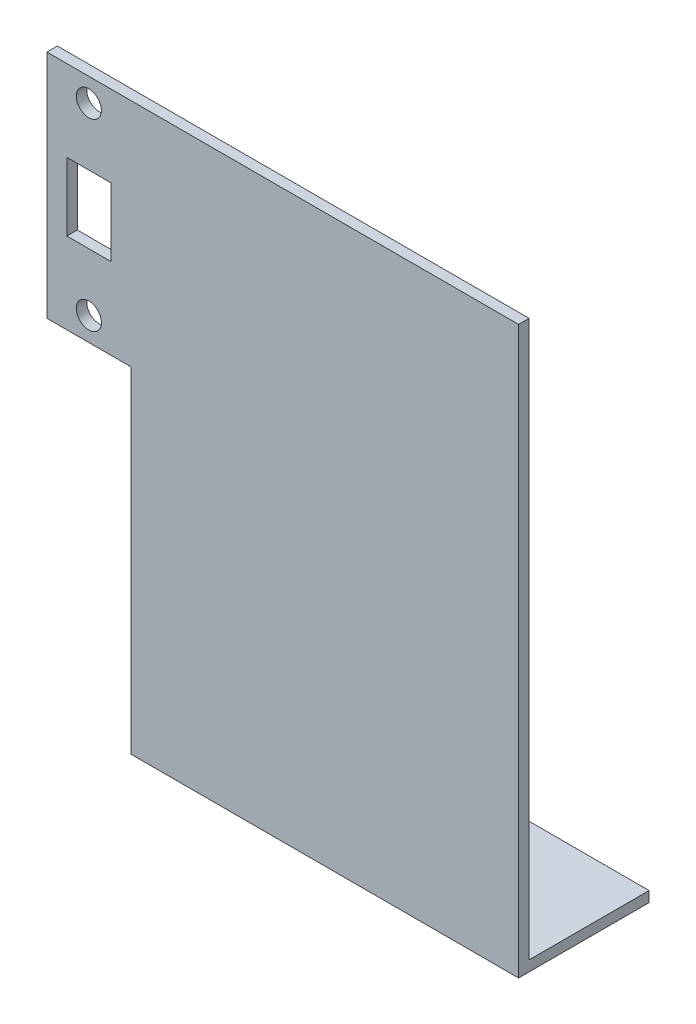
ISO-10303-21;
HEADER;
FILE_DESCRIPTION(('STEP AP214'),'2;1');
FILE_NAME('part.step','',(''),(''),'','','');
FILE_SCHEMA(('AUTOMOTIVE_DESIGN { 1 0 10303 214 1 1 1 1 }'));
ENDSEC;
DATA;
#1=APPLICATION_CONTEXT('core data for automotive mechanical design processes');
#2=APPLICATION_PROTOCOL_DEFINITION('international standard','automotive_design',2000,#1);
#3=PRODUCT_CONTEXT('',#1,'mechanical');
#4=PRODUCT('Part','Part','',(#3));
#5=PRODUCT_RELATED_PRODUCT_CATEGORY('part','',(#4));
#6=PRODUCT_DEFINITION_FORMATION('','',#4);
#7=PRODUCT_DEFINITION_CONTEXT('part definition',#1,'design');
#8=PRODUCT_DEFINITION('design','',#6,#7);
#9=PRODUCT_DEFINITION_SHAPE('','',#8);
#10=(LENGTH_UNIT() NAMED_UNIT(*) SI_UNIT(.MILLI.,.METRE.));
#11=(NAMED_UNIT(*) PLANE_ANGLE_UNIT() SI_UNIT($,.RADIAN.));
#12=(NAMED_UNIT(*) SI_UNIT($,.STERADIAN.) SOLID_ANGLE_UNIT());
#13=UNCERTAINTY_MEASURE_WITH_UNIT(LENGTH_MEASURE(1.E-05),#10,'distance_accuracy_value','');
#14=(GEOMETRIC_REPRESENTATION_CONTEXT(3) GLOBAL_UNCERTAINTY_ASSIGNED_CONTEXT((#13)) GLOBAL_UNIT_ASSIGNED_CONTEXT((#10,
#11,#12)) REPRESENTATION_CONTEXT('',''));
#15=CARTESIAN_POINT('',(0.,0.,0.));
#16=DIRECTION('',(0.,0.,1.));
#17=DIRECTION('',(1.,0.,0.));
#18=AXIS2_PLACEMENT_3D('',#15,#16,#17);
#19=CARTESIAN_POINT('',(0.,0.,0.));
#20=DIRECTION('',(0.,0.,1.));
#21=DIRECTION('',(1.,0.,0.));
#22=AXIS2_PLACEMENT_3D('',#19,#20,#21);
#23=PLANE('',#22);
#24=DIRECTION('',(1.,0.,0.));
#25=VECTOR('',#24,1.);
#26=CARTESIAN_POINT('',(0.,16.25,0.));
#27=LINE('',#26,#25);
#28=CARTESIAN_POINT('',(-24.6,16.25,0.));
#29=VERTEX_POINT('',#28);
#30=CARTESIAN_POINT('',(-20.4,16.25,0.));
#31=VERTEX_POINT('',#30);
#32=EDGE_CURVE('E44',#29,#31,#27,.T.);
#33=ORIENTED_EDGE('',*,*,#32,.T.);
#34=DIRECTION('',(0.,1.,0.));
#35=VECTOR('',#34,1.);
#36=CARTESIAN_POINT('',(-20.4,0.,0.));
#37=LINE('',#36,#35);
#38=CARTESIAN_POINT('',(-20.4,22.75,0.));
#39=VERTEX_POINT('',#38);
#40=EDGE_CURVE('E11',#31,#39,#37,.T.);
#41=ORIENTED_EDGE('',*,*,#40,.T.);
#42=DIRECTION('',(-1.,0.,0.));
#43=VECTOR('',#42,1.);
#44=CARTESIAN_POINT('',(0.,22.75,0.));
#45=LINE('',#44,#43);
#46=CARTESIAN_POINT('',(-24.6,22.75,0.));
#47=VERTEX_POINT('',#46);
#48=EDGE_CURVE('E215',#39,#47,#45,.T.);
#49=ORIENTED_EDGE('',*,*,#48,.T.);
#50=DIRECTION('',(0.,-1.,0.));
#51=VECTOR('',#50,1.);
#52=CARTESIAN_POINT('',(-24.6,0.,0.));
#53=LINE('',#52,#51);
#54=EDGE_CURVE('E218',#47,#29,#53,.T.);
#55=ORIENTED_EDGE('',*,*,#54,.T.);
#56=EDGE_LOOP('',(#33,#41,#49,#55));
#57=FACE_BOUND('',#56,.T.);
#58=CARTESIAN_POINT('',(-22.5,10.735,0.));
#59=DIRECTION('',(0.,0.,1.));
#60=DIRECTION('',(1.,0.,0.));
#61=AXIS2_PLACEMENT_3D('',#58,#59,#60);
#62=CIRCLE('',#61,1.2);
#63=CARTESIAN_POINT('',(-21.3,10.735,0.));
#64=VERTEX_POINT('',#63);
#65=EDGE_CURVE('E177',#64,#64,#62,.T.);
#66=ORIENTED_EDGE('',*,*,#65,.T.);
#67=EDGE_LOOP('',(#66));
#68=FACE_BOUND('',#67,.T.);
#69=CARTESIAN_POINT('',(-22.5,28.265,0.));
#70=DIRECTION('',(0.,0.,1.));
#71=DIRECTION('',(1.,0.,0.));
#72=AXIS2_PLACEMENT_3D('',#69,#70,#71);
#73=CIRCLE('',#72,1.2);
#74=CARTESIAN_POINT('',(-21.3,28.265,0.));
#75=VERTEX_POINT('',#74);
#76=EDGE_CURVE('E39',#75,#75,#73,.T.);
#77=ORIENTED_EDGE('',*,*,#76,.T.);
#78=EDGE_LOOP('',(#77));
#79=FACE_BOUND('',#78,.T.);
#80=DIRECTION('',(1.,0.,0.));
#81=VECTOR('',#80,1.);
#82=CARTESIAN_POINT('',(-18.5,-22.5,0.));
#83=LINE('',#82,#81);
#84=CARTESIAN_POINT('',(-18.5,-22.5,0.));
#85=VERTEX_POINT('',#84);
#86=CARTESIAN_POINT('',(18.5,-22.5,0.));
#87=VERTEX_POINT('',#86);
#88=EDGE_CURVE('E52',#85,#87,#83,.T.);
#89=ORIENTED_EDGE('',*,*,#88,.F.);
#90=DIRECTION('',(0.,-1.,0.));
#91=VECTOR('',#90,1.);
#92=CARTESIAN_POINT('',(-18.5,8.5,0.));
#93=LINE('',#92,#91);
#94=CARTESIAN_POINT('',(-18.5,8.5,0.));
#95=VERTEX_POINT('',#94);
#96=EDGE_CURVE('E134',#95,#85,#93,.T.);
#97=ORIENTED_EDGE('',*,*,#96,.F.);
#98=DIRECTION('',(1.,0.,0.));
#99=VECTOR('',#98,1.);
#100=CARTESIAN_POINT('',(-26.5,8.5,0.));
#101=LINE('',#100,#99);
#102=CARTESIAN_POINT('',(-26.5,8.5,0.));
#103=VERTEX_POINT('',#102);
#104=EDGE_CURVE('E198',#103,#95,#101,.T.);
#105=ORIENTED_EDGE('',*,*,#104,.F.);
#106=DIRECTION('',(0.,-1.,0.));
#107=VECTOR('',#106,1.);
#108=CARTESIAN_POINT('',(-26.5,30.5,0.));
#109=LINE('',#108,#107);
#110=CARTESIAN_POINT('',(-26.5,30.5,0.));
#111=VERTEX_POINT('',#110);
#112=EDGE_CURVE('E196',#111,#103,#109,.T.);
#113=ORIENTED_EDGE('',*,*,#112,.F.);
#114=DIRECTION('',(-1.,0.,0.));
#115=VECTOR('',#114,1.);
#116=CARTESIAN_POINT('',(-18.5,30.5,0.));
#117=LINE('',#116,#115);
#118=CARTESIAN_POINT('',(18.5,30.5,0.));
#119=VERTEX_POINT('',#118);
#120=EDGE_CURVE('E129',#119,#111,#117,.T.);
#121=ORIENTED_EDGE('',*,*,#120,.F.);
#122=DIRECTION('',(0.,1.,0.));
#123=VECTOR('',#122,1.);
#124=CARTESIAN_POINT('',(18.5,23.5,0.));
#125=LINE('',#124,#123);
#126=EDGE_CURVE('E126',#87,#119,#125,.T.);
#127=ORIENTED_EDGE('',*,*,#126,.F.);
#128=EDGE_LOOP('',(#89,#97,#105,#113,#121,#127));
#129=FACE_BOUND('',#128,.T.);
#130=ADVANCED_FACE('F35',(#57,#68,#79,#129),#23,.F.);
#131=CARTESIAN_POINT('',(-18.5,30.5,1.));
#132=DIRECTION('',(0.,-1.,0.));
#133=DIRECTION('',(0.,0.,-1.));
#134=AXIS2_PLACEMENT_3D('',#131,#132,#133);
#135=PLANE('',#134);
#136=ORIENTED_EDGE('',*,*,#120,.T.);
#137=DIRECTION('',(0.,0.,-1.));
#138=VECTOR('',#137,1.);
#139=CARTESIAN_POINT('',(-26.5,30.5,1.));
#140=LINE('',#139,#138);
#141=CARTESIAN_POINT('',(-26.5,30.5,1.));
#142=VERTEX_POINT('',#141);
#143=EDGE_CURVE('E212',#142,#111,#140,.T.);
#144=ORIENTED_EDGE('',*,*,#143,.F.);
#145=DIRECTION('',(-1.,0.,0.));
#146=VECTOR('',#145,1.);
#147=CARTESIAN_POINT('',(18.5,30.5,1.));
#148=LINE('',#147,#146);
#149=CARTESIAN_POINT('',(18.5,30.5,1.));
#150=VERTEX_POINT('',#149);
#151=EDGE_CURVE('E133',#150,#142,#148,.T.);
#152=ORIENTED_EDGE('',*,*,#151,.F.);
#153=DIRECTION('',(0.,0.,-1.));
#154=VECTOR('',#153,1.);
#155=CARTESIAN_POINT('',(18.5,30.5,1.));
#156=LINE('',#155,#154);
#157=EDGE_CURVE('E194',#150,#119,#156,.T.);
#158=ORIENTED_EDGE('',*,*,#157,.T.);
#159=EDGE_LOOP('',(#136,#144,#152,#158));
#160=FACE_BOUND('',#159,.T.);
#161=ADVANCED_FACE('F37',(#160),#135,.F.);
#162=CARTESIAN_POINT('',(-26.5,30.5,1.));
#163=DIRECTION('',(1.,0.,0.));
#164=DIRECTION('',(0.,1.,0.));
#165=AXIS2_PLACEMENT_3D('',#162,#163,#164);
#166=PLANE('',#165);
#167=ORIENTED_EDGE('',*,*,#112,.T.);
#168=DIRECTION('',(0.,0.,-1.));
#169=VECTOR('',#168,1.);
#170=CARTESIAN_POINT('',(-26.5,8.5,1.));
#171=LINE('',#170,#169);
#172=CARTESIAN_POINT('',(-26.5,8.5,1.));
#173=VERTEX_POINT('',#172);
#174=EDGE_CURVE('E209',#173,#103,#171,.T.);
#175=ORIENTED_EDGE('',*,*,#174,.F.);
#176=DIRECTION('',(0.,-1.,0.));
#177=VECTOR('',#176,1.);
#178=CARTESIAN_POINT('',(-26.5,30.5,1.));
#179=LINE('',#178,#177);
#180=EDGE_CURVE('E184',#142,#173,#179,.T.);
#181=ORIENTED_EDGE('',*,*,#180,.F.);
#182=ORIENTED_EDGE('',*,*,#143,.T.);
#183=EDGE_LOOP('',(#167,#175,#181,#182));
#184=FACE_BOUND('',#183,.T.);
#185=ADVANCED_FACE('F250',(#184),#166,.F.);
#186=CARTESIAN_POINT('',(-26.5,8.5,1.));
#187=DIRECTION('',(0.,1.,0.));
#188=DIRECTION('',(0.,0.,1.));
#189=AXIS2_PLACEMENT_3D('',#186,#187,#188);
#190=PLANE('',#189);
#191=ORIENTED_EDGE('',*,*,#104,.T.);
#192=DIRECTION('',(0.,0.,-1.));
#193=VECTOR('',#192,1.);
#194=CARTESIAN_POINT('',(-18.5,8.5,1.));
#195=LINE('',#194,#193);
#196=CARTESIAN_POINT('',(-18.5,8.5,1.));
#197=VERTEX_POINT('',#196);
#198=EDGE_CURVE('E206',#197,#95,#195,.T.);
#199=ORIENTED_EDGE('',*,*,#198,.F.);
#200=DIRECTION('',(1.,0.,0.));
#201=VECTOR('',#200,1.);
#202=CARTESIAN_POINT('',(-26.5,8.5,1.));
#203=LINE('',#202,#201);
#204=EDGE_CURVE('E186',#173,#197,#203,.T.);
#205=ORIENTED_EDGE('',*,*,#204,.F.);
#206=ORIENTED_EDGE('',*,*,#174,.T.);
#207=EDGE_LOOP('',(#191,#199,#205,#206));
#208=FACE_BOUND('',#207,.T.);
#209=ADVANCED_FACE('F265',(#208),#190,.F.);
#210=CARTESIAN_POINT('',(-18.5,8.5,1.));
#211=DIRECTION('',(1.,0.,0.));
#212=DIRECTION('',(0.,1.,0.));
#213=AXIS2_PLACEMENT_3D('',#210,#211,#212);
#214=PLANE('',#213);
#215=ORIENTED_EDGE('',*,*,#96,.T.);
#216=DIRECTION('',(0.,0.,1.));
#217=VECTOR('',#216,1.);
#218=CARTESIAN_POINT('',(-18.5,-22.5,-48.4635110466435));
#219=LINE('',#218,#217);
#220=CARTESIAN_POINT('',(-18.5,-22.5,-11.45));
#221=VERTEX_POINT('',#220);
#222=EDGE_CURVE('E144',#221,#85,#219,.T.);
#223=ORIENTED_EDGE('',*,*,#222,.F.);
#224=DIRECTION('',(0.,-1.,0.));
#225=VECTOR('',#224,1.);
#226=CARTESIAN_POINT('',(-18.5,-23.5,-11.45));
#227=LINE('',#226,#225);
#228=CARTESIAN_POINT('',(-18.5,-23.5,-11.45));
#229=VERTEX_POINT('',#228);
#230=EDGE_CURVE('E151',#221,#229,#227,.T.);
#231=ORIENTED_EDGE('',*,*,#230,.T.);
#232=DIRECTION('',(0.,0.,-1.));
#233=VECTOR('',#232,1.);
#234=CARTESIAN_POINT('',(-18.5,-23.5,1.));
#235=LINE('',#234,#233);
#236=CARTESIAN_POINT('',(-18.5,-23.5,1.));
#237=VERTEX_POINT('',#236);
#238=EDGE_CURVE('E204',#237,#229,#235,.T.);
#239=ORIENTED_EDGE('',*,*,#238,.F.);
#240=DIRECTION('',(0.,-1.,0.));
#241=VECTOR('',#240,1.);
#242=CARTESIAN_POINT('',(-18.5,8.5,1.));
#243=LINE('',#242,#241);
#244=EDGE_CURVE('E188',#197,#237,#243,.T.);
#245=ORIENTED_EDGE('',*,*,#244,.F.);
#246=ORIENTED_EDGE('',*,*,#198,.T.);
#247=EDGE_LOOP('',(#215,#223,#231,#239,#245,#246));
#248=FACE_BOUND('',#247,.T.);
#249=ADVANCED_FACE('F261',(#248),#214,.F.);
#250=CARTESIAN_POINT('',(-18.5,-23.5,1.));
#251=DIRECTION('',(0.,1.,0.));
#252=DIRECTION('',(0.,0.,1.));
#253=AXIS2_PLACEMENT_3D('',#250,#251,#252);
#254=PLANE('',#253);
#255=ORIENTED_EDGE('',*,*,#238,.T.);
#256=DIRECTION('',(1.,0.,0.));
#257=VECTOR('',#256,1.);
#258=CARTESIAN_POINT('',(-18.5,-23.5,-11.45));
#259=LINE('',#258,#257);
#260=CARTESIAN_POINT('',(18.5,-23.5,-11.45));
#261=VERTEX_POINT('',#260);
#262=EDGE_CURVE('E155',#229,#261,#259,.T.);
#263=ORIENTED_EDGE('',*,*,#262,.T.);
#264=DIRECTION('',(0.,0.,-1.));
#265=VECTOR('',#264,1.);
#266=CARTESIAN_POINT('',(18.5,-23.5,1.));
#267=LINE('',#266,#265);
#268=CARTESIAN_POINT('',(18.5,-23.5,1.));
#269=VERTEX_POINT('',#268);
#270=EDGE_CURVE('E202',#269,#261,#267,.T.);
#271=ORIENTED_EDGE('',*,*,#270,.F.);
#272=DIRECTION('',(1.,0.,0.));
#273=VECTOR('',#272,1.);
#274=CARTESIAN_POINT('',(-18.5,-23.5,1.));
#275=LINE('',#274,#273);
#276=EDGE_CURVE('E190',#237,#269,#275,.T.);
#277=ORIENTED_EDGE('',*,*,#276,.F.);
#278=EDGE_LOOP('',(#255,#263,#271,#277));
#279=FACE_BOUND('',#278,.T.);
#280=ADVANCED_FACE('F258',(#279),#254,.F.);
#281=CARTESIAN_POINT('',(18.5,23.5,1.));
#282=DIRECTION('',(-1.,0.,0.));
#283=DIRECTION('',(0.,0.,1.));
#284=AXIS2_PLACEMENT_3D('',#281,#282,#283);
#285=PLANE('',#284);
#286=ORIENTED_EDGE('',*,*,#270,.T.);
#287=DIRECTION('',(0.,1.,0.));
#288=VECTOR('',#287,1.);
#289=CARTESIAN_POINT('',(18.5,-23.5,-11.45));
#290=LINE('',#289,#288);
#291=CARTESIAN_POINT('',(18.5,-22.5,-11.45));
#292=VERTEX_POINT('',#291);
#293=EDGE_CURVE('E141',#261,#292,#290,.T.);
#294=ORIENTED_EDGE('',*,*,#293,.T.);
#295=DIRECTION('',(0.,0.,1.));
#296=VECTOR('',#295,1.);
#297=CARTESIAN_POINT('',(18.5,-22.5,-48.4635110466435));
#298=LINE('',#297,#296);
#299=EDGE_CURVE('E138',#292,#87,#298,.T.);
#300=ORIENTED_EDGE('',*,*,#299,.T.);
#301=ORIENTED_EDGE('',*,*,#126,.T.);
#302=ORIENTED_EDGE('',*,*,#157,.F.);
#303=DIRECTION('',(0.,1.,0.));
#304=VECTOR('',#303,1.);
#305=CARTESIAN_POINT('',(18.5,-23.5,1.));
#306=LINE('',#305,#304);
#307=EDGE_CURVE('E192',#269,#150,#306,.T.);
#308=ORIENTED_EDGE('',*,*,#307,.F.);
#309=EDGE_LOOP('',(#286,#294,#300,#301,#302,#308));
#310=FACE_BOUND('',#309,.T.);
#311=ADVANCED_FACE('F139',(#310),#285,.F.);
#312=CARTESIAN_POINT('',(0.,0.,1.));
#313=DIRECTION('',(0.,0.,1.));
#314=DIRECTION('',(1.,0.,0.));
#315=AXIS2_PLACEMENT_3D('',#312,#313,#314);
#316=PLANE('',#315);
#317=CARTESIAN_POINT('',(-22.5,28.265,1.));
#318=DIRECTION('',(0.,0.,1.));
#319=DIRECTION('',(1.,0.,0.));
#320=AXIS2_PLACEMENT_3D('',#317,#318,#319);
#321=CIRCLE('',#320,1.2);
#322=CARTESIAN_POINT('',(-21.3,28.265,1.));
#323=VERTEX_POINT('',#322);
#324=EDGE_CURVE('E161',#323,#323,#321,.T.);
#325=ORIENTED_EDGE('',*,*,#324,.F.);
#326=EDGE_LOOP('',(#325));
#327=FACE_BOUND('',#326,.T.);
#328=CARTESIAN_POINT('',(-22.5,10.735,1.));
#329=DIRECTION('',(0.,0.,1.));
#330=DIRECTION('',(1.,0.,0.));
#331=AXIS2_PLACEMENT_3D('',#328,#329,#330);
#332=CIRCLE('',#331,1.2);
#333=CARTESIAN_POINT('',(-21.3,10.735,1.));
#334=VERTEX_POINT('',#333);
#335=EDGE_CURVE('E158',#334,#334,#332,.T.);
#336=ORIENTED_EDGE('',*,*,#335,.F.);
#337=EDGE_LOOP('',(#336));
#338=FACE_BOUND('',#337,.T.);
#339=DIRECTION('',(0.,1.,0.));
#340=VECTOR('',#339,1.);
#341=CARTESIAN_POINT('',(-20.4,22.75,1.));
#342=LINE('',#341,#340);
#343=CARTESIAN_POINT('',(-20.4,16.25,1.));
#344=VERTEX_POINT('',#343);
#345=CARTESIAN_POINT('',(-20.4,22.75,1.));
#346=VERTEX_POINT('',#345);
#347=EDGE_CURVE('E60',#344,#346,#342,.T.);
#348=ORIENTED_EDGE('',*,*,#347,.F.);
#349=DIRECTION('',(1.,0.,0.));
#350=VECTOR('',#349,1.);
#351=CARTESIAN_POINT('',(-24.6,16.25,1.));
#352=LINE('',#351,#350);
#353=CARTESIAN_POINT('',(-24.6,16.25,1.));
#354=VERTEX_POINT('',#353);
#355=EDGE_CURVE('E171',#354,#344,#352,.T.);
#356=ORIENTED_EDGE('',*,*,#355,.F.);
#357=DIRECTION('',(0.,-1.,0.));
#358=VECTOR('',#357,1.);
#359=CARTESIAN_POINT('',(-24.6,22.75,1.));
#360=LINE('',#359,#358);
#361=CARTESIAN_POINT('',(-24.6,22.75,1.));
#362=VERTEX_POINT('',#361);
#363=EDGE_CURVE('E168',#362,#354,#360,.T.);
#364=ORIENTED_EDGE('',*,*,#363,.F.);
#365=DIRECTION('',(-1.,0.,0.));
#366=VECTOR('',#365,1.);
#367=CARTESIAN_POINT('',(-24.6,22.75,1.));
#368=LINE('',#367,#366);
#369=EDGE_CURVE('E165',#346,#362,#368,.T.);
#370=ORIENTED_EDGE('',*,*,#369,.F.);
#371=EDGE_LOOP('',(#348,#356,#364,#370));
#372=FACE_BOUND('',#371,.T.);
#373=ORIENTED_EDGE('',*,*,#151,.T.);
#374=ORIENTED_EDGE('',*,*,#180,.T.);
#375=ORIENTED_EDGE('',*,*,#204,.T.);
#376=ORIENTED_EDGE('',*,*,#244,.T.);
#377=ORIENTED_EDGE('',*,*,#276,.T.);
#378=ORIENTED_EDGE('',*,*,#307,.T.);
#379=EDGE_LOOP('',(#373,#374,#375,#376,#377,#378));
#380=FACE_BOUND('',#379,.T.);
#381=ADVANCED_FACE('F254',(#327,#338,#372,#380),#316,.T.);
#382=CARTESIAN_POINT('',(-20.4,22.75,-10.));
#383=DIRECTION('',(1.,0.,0.));
#384=DIRECTION('',(0.,0.,-1.));
#385=AXIS2_PLACEMENT_3D('',#382,#383,#384);
#386=PLANE('',#385);
#387=DIRECTION('',(0.,0.,1.));
#388=VECTOR('',#387,1.);
#389=CARTESIAN_POINT('',(-20.4,16.25,-10.));
#390=LINE('',#389,#388);
#391=EDGE_CURVE('E175',#31,#344,#390,.T.);
#392=ORIENTED_EDGE('',*,*,#391,.T.);
#393=ORIENTED_EDGE('',*,*,#347,.T.);
#394=DIRECTION('',(0.,0.,1.));
#395=VECTOR('',#394,1.);
#396=CARTESIAN_POINT('',(-20.4,22.75,-10.));
#397=LINE('',#396,#395);
#398=EDGE_CURVE('E174',#39,#346,#397,.T.);
#399=ORIENTED_EDGE('',*,*,#398,.F.);
#400=ORIENTED_EDGE('',*,*,#40,.F.);
#401=EDGE_LOOP('',(#392,#393,#399,#400));
#402=FACE_BOUND('',#401,.T.);
#403=ADVANCED_FACE('F364',(#402),#386,.F.);
#404=CARTESIAN_POINT('',(-24.6,16.25,-10.));
#405=DIRECTION('',(0.,-1.,0.));
#406=DIRECTION('',(0.,0.,-1.));
#407=AXIS2_PLACEMENT_3D('',#404,#405,#406);
#408=PLANE('',#407);
#409=DIRECTION('',(0.,0.,1.));
#410=VECTOR('',#409,1.);
#411=CARTESIAN_POINT('',(-24.6,16.25,-10.));
#412=LINE('',#411,#410);
#413=EDGE_CURVE('E178',#29,#354,#412,.T.);
#414=ORIENTED_EDGE('',*,*,#413,.T.);
#415=ORIENTED_EDGE('',*,*,#355,.T.);
#416=ORIENTED_EDGE('',*,*,#391,.F.);
#417=ORIENTED_EDGE('',*,*,#32,.F.);
#418=EDGE_LOOP('',(#414,#415,#416,#417));
#419=FACE_BOUND('',#418,.T.);
#420=ADVANCED_FACE('F354',(#419),#408,.F.);
#421=CARTESIAN_POINT('',(-24.6,22.75,-10.));
#422=DIRECTION('',(-1.,0.,0.));
#423=DIRECTION('',(0.,0.,1.));
#424=AXIS2_PLACEMENT_3D('',#421,#422,#423);
#425=PLANE('',#424);
#426=DIRECTION('',(0.,0.,1.));
#427=VECTOR('',#426,1.);
#428=CARTESIAN_POINT('',(-24.6,22.75,-10.));
#429=LINE('',#428,#427);
#430=EDGE_CURVE('E180',#47,#362,#429,.T.);
#431=ORIENTED_EDGE('',*,*,#430,.T.);
#432=ORIENTED_EDGE('',*,*,#363,.T.);
#433=ORIENTED_EDGE('',*,*,#413,.F.);
#434=ORIENTED_EDGE('',*,*,#54,.F.);
#435=EDGE_LOOP('',(#431,#432,#433,#434));
#436=FACE_BOUND('',#435,.T.);
#437=ADVANCED_FACE('F344',(#436),#425,.F.);
#438=CARTESIAN_POINT('',(-24.6,22.75,-10.));
#439=DIRECTION('',(0.,1.,0.));
#440=DIRECTION('',(0.,0.,1.));
#441=AXIS2_PLACEMENT_3D('',#438,#439,#440);
#442=PLANE('',#441);
#443=ORIENTED_EDGE('',*,*,#398,.T.);
#444=ORIENTED_EDGE('',*,*,#369,.T.);
#445=ORIENTED_EDGE('',*,*,#430,.F.);
#446=ORIENTED_EDGE('',*,*,#48,.F.);
#447=EDGE_LOOP('',(#443,#444,#445,#446));
#448=FACE_BOUND('',#447,.T.);
#449=ADVANCED_FACE('F240',(#448),#442,.F.);
#450=CARTESIAN_POINT('',(-22.5,10.735,-10.));
#451=DIRECTION('',(0.,0.,1.));
#452=DIRECTION('',(1.,0.,0.));
#453=AXIS2_PLACEMENT_3D('',#450,#451,#452);
#454=CYLINDRICAL_SURFACE('',#453,1.2);
#455=ORIENTED_EDGE('',*,*,#335,.T.);
#456=EDGE_LOOP('',(#455));
#457=FACE_BOUND('',#456,.T.);
#458=ORIENTED_EDGE('',*,*,#65,.F.);
#459=EDGE_LOOP('',(#458));
#460=FACE_BOUND('',#459,.T.);
#461=ADVANCED_FACE('F231',(#457,#460),#454,.F.);
#462=CARTESIAN_POINT('',(-22.5,28.265,-10.));
#463=DIRECTION('',(0.,0.,1.));
#464=DIRECTION('',(1.,0.,0.));
#465=AXIS2_PLACEMENT_3D('',#462,#463,#464);
#466=CYLINDRICAL_SURFACE('',#465,1.2);
#467=ORIENTED_EDGE('',*,*,#324,.T.);
#468=EDGE_LOOP('',(#467));
#469=FACE_BOUND('',#468,.T.);
#470=ORIENTED_EDGE('',*,*,#76,.F.);
#471=EDGE_LOOP('',(#470));
#472=FACE_BOUND('',#471,.T.);
#473=ADVANCED_FACE('F229',(#469,#472),#466,.F.);
#474=CARTESIAN_POINT('',(-18.5,-22.5,-48.4635110466435));
#475=DIRECTION('',(0.,-1.,0.));
#476=DIRECTION('',(0.,0.,-1.));
#477=AXIS2_PLACEMENT_3D('',#474,#475,#476);
#478=PLANE('',#477);
#479=ORIENTED_EDGE('',*,*,#299,.F.);
#480=DIRECTION('',(-1.,0.,0.));
#481=VECTOR('',#480,1.);
#482=CARTESIAN_POINT('',(-18.5,-22.5,-11.45));
#483=LINE('',#482,#481);
#484=EDGE_CURVE('E289',#292,#221,#483,.T.);
#485=ORIENTED_EDGE('',*,*,#484,.T.);
#486=ORIENTED_EDGE('',*,*,#222,.T.);
#487=ORIENTED_EDGE('',*,*,#88,.T.);
#488=EDGE_LOOP('',(#479,#485,#486,#487));
#489=FACE_BOUND('',#488,.T.);
#490=ADVANCED_FACE('F147',(#489),#478,.F.);
#491=CARTESIAN_POINT('',(-17.6,24.5317767474149,-11.45));
#492=DIRECTION('',(0.,0.,1.));
#493=DIRECTION('',(-1.,0.,0.));
#494=AXIS2_PLACEMENT_3D('',#491,#492,#493);
#495=PLANE('',#494);
#496=ORIENTED_EDGE('',*,*,#484,.F.);
#497=ORIENTED_EDGE('',*,*,#293,.F.);
#498=ORIENTED_EDGE('',*,*,#262,.F.);
#499=ORIENTED_EDGE('',*,*,#230,.F.);
#500=EDGE_LOOP('',(#496,#497,#498,#499));
#501=FACE_BOUND('',#500,.T.);
#502=ADVANCED_FACE('F238',(#501),#495,.F.);
#503=CLOSED_SHELL('',(#130,#161,#185,#209,#249,#280,#311,#381,#403,#420,#437,#449,#461,#473,
#490,#502));
#504=MANIFOLD_SOLID_BREP('B2',#503);
#505=ADVANCED_BREP_SHAPE_REPRESENTATION('',(#18,#504),#14);
#506=SHAPE_DEFINITION_REPRESENTATION(#9,#505);
ENDSEC;
END-ISO-10303-21;
